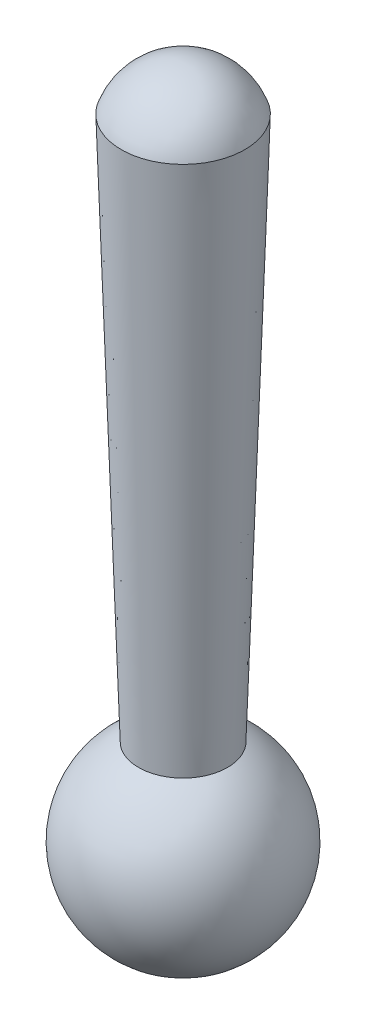
ISO-10303-21;
HEADER;
FILE_DESCRIPTION(('STEP AP214'),'2;1');
FILE_NAME('part.step','',(''),(''),'','','');
FILE_SCHEMA(('AUTOMOTIVE_DESIGN { 1 0 10303 214 1 1 1 1 }'));
ENDSEC;
DATA;
#1=APPLICATION_CONTEXT('core data for automotive mechanical design processes');
#2=APPLICATION_PROTOCOL_DEFINITION('international standard','automotive_design',2000,#1);
#3=PRODUCT_CONTEXT('',#1,'mechanical');
#4=PRODUCT('Part','Part','',(#3));
#5=PRODUCT_RELATED_PRODUCT_CATEGORY('part','',(#4));
#6=PRODUCT_DEFINITION_FORMATION('','',#4);
#7=PRODUCT_DEFINITION_CONTEXT('part definition',#1,'design');
#8=PRODUCT_DEFINITION('design','',#6,#7);
#9=PRODUCT_DEFINITION_SHAPE('','',#8);
#10=(LENGTH_UNIT() NAMED_UNIT(*) SI_UNIT(.MILLI.,.METRE.));
#11=(NAMED_UNIT(*) PLANE_ANGLE_UNIT() SI_UNIT($,.RADIAN.));
#12=(NAMED_UNIT(*) SI_UNIT($,.STERADIAN.) SOLID_ANGLE_UNIT());
#13=UNCERTAINTY_MEASURE_WITH_UNIT(LENGTH_MEASURE(1.E-05),#10,'distance_accuracy_value','');
#14=(GEOMETRIC_REPRESENTATION_CONTEXT(3) GLOBAL_UNCERTAINTY_ASSIGNED_CONTEXT((#13)) GLOBAL_UNIT_ASSIGNED_CONTEXT((#10,
#11,#12)) REPRESENTATION_CONTEXT('',''));
#15=CARTESIAN_POINT('',(0.,0.,0.));
#16=DIRECTION('',(0.,0.,1.));
#17=DIRECTION('',(1.,0.,0.));
#18=AXIS2_PLACEMENT_3D('',#15,#16,#17);
#19=CARTESIAN_POINT('',(0.,12.320759118219,0.));
#20=DIRECTION('',(0.,-1.,0.));
#21=DIRECTION('',(-1.,0.,0.));
#22=AXIS2_PLACEMENT_3D('',#19,#20,#21);
#23=SPHERICAL_SURFACE('',#22,1.31879782047376);
#24=CARTESIAN_POINT('',(0.,12.7411490458889,0.));
#25=DIRECTION('',(0.,-1.,0.));
#26=DIRECTION('',(0.,0.,-1.));
#27=AXIS2_PLACEMENT_3D('',#24,#25,#26);
#28=CIRCLE('',#27,1.25);
#29=CARTESIAN_POINT('',(0.,12.7411490458889,-1.25));
#30=VERTEX_POINT('',#29);
#31=EDGE_CURVE('E10',#30,#30,#28,.T.);
#32=ORIENTED_EDGE('',*,*,#31,.F.);
#33=EDGE_LOOP('',(#32));
#34=FACE_BOUND('',#33,.T.);
#35=ADVANCED_FACE('F33',(#34),#23,.T.);
#36=CARTESIAN_POINT('',(0.,1.74114904588895,0.));
#37=DIRECTION('',(0.,1.,0.));
#38=DIRECTION('',(0.,0.,1.));
#39=AXIS2_PLACEMENT_3D('',#36,#37,#38);
#40=CONICAL_SURFACE('',#39,0.9,0.0318074507951631);
#41=ORIENTED_EDGE('',*,*,#31,.T.);
#42=EDGE_LOOP('',(#41));
#43=FACE_BOUND('',#42,.T.);
#44=CARTESIAN_POINT('',(0.,1.74114904588895,0.));
#45=DIRECTION('',(0.,-1.,0.));
#46=DIRECTION('',(0.,0.,-1.));
#47=AXIS2_PLACEMENT_3D('',#44,#45,#46);
#48=CIRCLE('',#47,0.9);
#49=CARTESIAN_POINT('',(0.,1.74114904588895,-0.9));
#50=VERTEX_POINT('',#49);
#51=EDGE_CURVE('E39',#50,#50,#48,.T.);
#52=ORIENTED_EDGE('',*,*,#51,.F.);
#53=EDGE_LOOP('',(#52));
#54=FACE_BOUND('',#53,.T.);
#55=ADVANCED_FACE('F47',(#43,#54),#40,.T.);
#56=CARTESIAN_POINT('',(0.,0.,0.));
#57=DIRECTION('',(0.,-1.,0.));
#58=DIRECTION('',(-1.,0.,0.));
#59=AXIS2_PLACEMENT_3D('',#56,#57,#58);
#60=SPHERICAL_SURFACE('',#59,1.96);
#61=ORIENTED_EDGE('',*,*,#51,.T.);
#62=EDGE_LOOP('',(#61));
#63=FACE_BOUND('',#62,.T.);
#64=ADVANCED_FACE('F45',(#63),#60,.T.);
#65=CLOSED_SHELL('',(#35,#55,#64));
#66=MANIFOLD_SOLID_BREP('B2',#65);
#67=ADVANCED_BREP_SHAPE_REPRESENTATION('',(#18,#66),#14);
#68=SHAPE_DEFINITION_REPRESENTATION(#9,#67);
ENDSEC;
END-ISO-10303-21;
